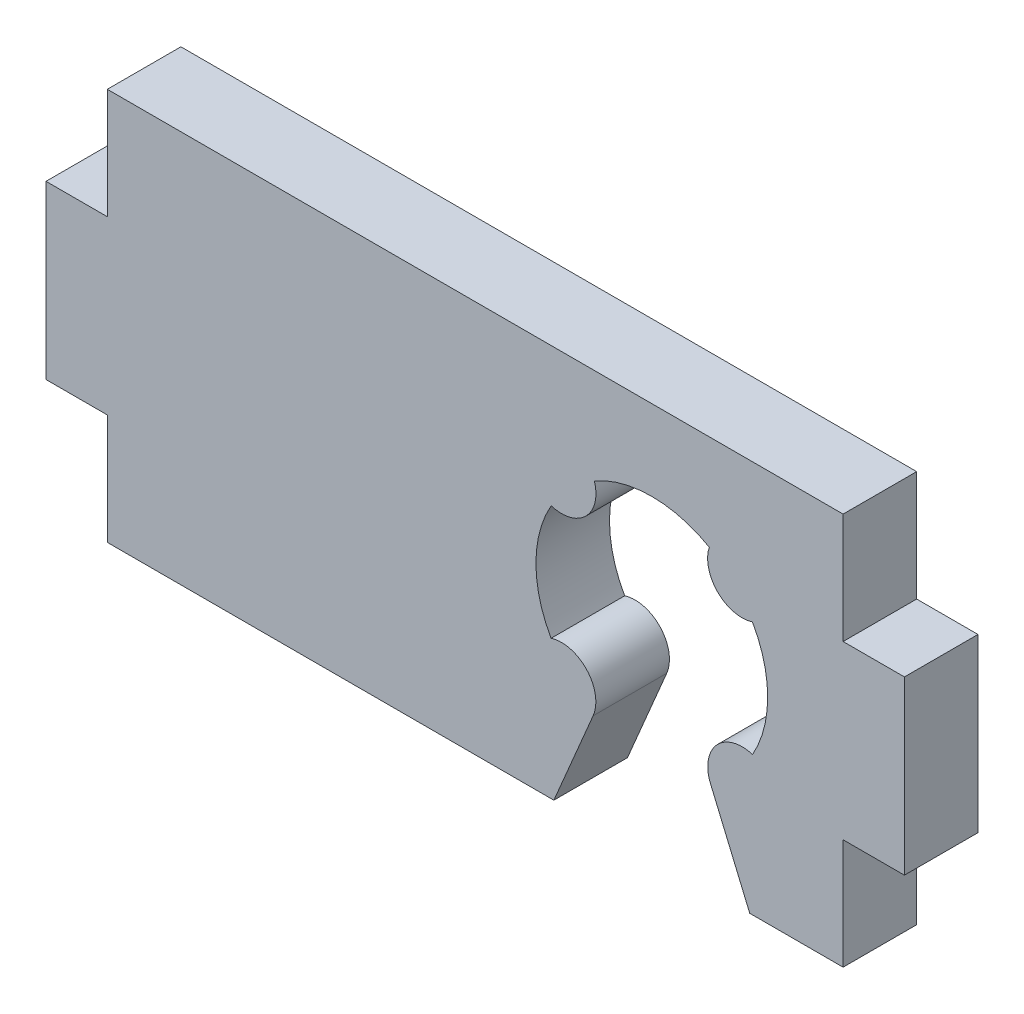
ISO-10303-21;
HEADER;
FILE_DESCRIPTION(('STEP AP214'),'2;1');
FILE_NAME('part.step','',(''),(''),'','','');
FILE_SCHEMA(('AUTOMOTIVE_DESIGN { 1 0 10303 214 1 1 1 1 }'));
ENDSEC;
DATA;
#1=APPLICATION_CONTEXT('core data for automotive mechanical design processes');
#2=APPLICATION_PROTOCOL_DEFINITION('international standard','automotive_design',2000,#1);
#3=PRODUCT_CONTEXT('',#1,'mechanical');
#4=PRODUCT('Part','Part','',(#3));
#5=PRODUCT_RELATED_PRODUCT_CATEGORY('part','',(#4));
#6=PRODUCT_DEFINITION_FORMATION('','',#4);
#7=PRODUCT_DEFINITION_CONTEXT('part definition',#1,'design');
#8=PRODUCT_DEFINITION('design','',#6,#7);
#9=PRODUCT_DEFINITION_SHAPE('','',#8);
#10=(LENGTH_UNIT() NAMED_UNIT(*) SI_UNIT(.MILLI.,.METRE.));
#11=(NAMED_UNIT(*) PLANE_ANGLE_UNIT() SI_UNIT($,.RADIAN.));
#12=(NAMED_UNIT(*) SI_UNIT($,.STERADIAN.) SOLID_ANGLE_UNIT());
#13=UNCERTAINTY_MEASURE_WITH_UNIT(LENGTH_MEASURE(1.E-05),#10,'distance_accuracy_value','');
#14=(GEOMETRIC_REPRESENTATION_CONTEXT(3) GLOBAL_UNCERTAINTY_ASSIGNED_CONTEXT((#13)) GLOBAL_UNIT_ASSIGNED_CONTEXT((#10,
#11,#12)) REPRESENTATION_CONTEXT('',''));
#15=CARTESIAN_POINT('',(0.,0.,0.));
#16=DIRECTION('',(0.,0.,1.));
#17=DIRECTION('',(1.,0.,0.));
#18=AXIS2_PLACEMENT_3D('',#15,#16,#17);
#19=CARTESIAN_POINT('',(-3.67695526217091,3.67695526216971,3.));
#20=DIRECTION('',(0.,0.,-1.));
#21=DIRECTION('',(-1.,0.,0.));
#22=AXIS2_PLACEMENT_3D('',#19,#20,#21);
#23=CYLINDRICAL_SURFACE('',#22,1.40000000000013);
#24=CARTESIAN_POINT('',(-3.67695526217091,3.67695526216971,0.));
#25=DIRECTION('',(0.,0.,1.));
#26=DIRECTION('',(1.,0.,0.));
#27=AXIS2_PLACEMENT_3D('',#24,#25,#26);
#28=CIRCLE('',#27,1.40000000000013);
#29=CARTESIAN_POINT('',(-4.10296874274699,2.34334643107724,0.));
#30=VERTEX_POINT('',#29);
#31=CARTESIAN_POINT('',(-2.34334643107859,4.10296874274622,0.));
#32=VERTEX_POINT('',#31);
#33=EDGE_CURVE('E213',#30,#32,#28,.T.);
#34=ORIENTED_EDGE('',*,*,#33,.T.);
#35=DIRECTION('',(0.,0.,-1.));
#36=VECTOR('',#35,1.);
#37=CARTESIAN_POINT('',(-2.34334643107859,4.10296874274622,3.));
#38=LINE('',#37,#36);
#39=CARTESIAN_POINT('',(-2.34334643107859,4.10296874274622,3.));
#40=VERTEX_POINT('',#39);
#41=EDGE_CURVE('E11',#40,#32,#38,.T.);
#42=ORIENTED_EDGE('',*,*,#41,.F.);
#43=CARTESIAN_POINT('',(-3.67695526217091,3.67695526216971,3.));
#44=DIRECTION('',(0.,0.,1.));
#45=DIRECTION('',(1.,0.,0.));
#46=AXIS2_PLACEMENT_3D('',#43,#44,#45);
#47=CIRCLE('',#46,1.40000000000013);
#48=CARTESIAN_POINT('',(-4.10296874274699,2.34334643107724,3.));
#49=VERTEX_POINT('',#48);
#50=EDGE_CURVE('E255',#49,#40,#47,.T.);
#51=ORIENTED_EDGE('',*,*,#50,.F.);
#52=DIRECTION('',(0.,0.,-1.));
#53=VECTOR('',#52,1.);
#54=CARTESIAN_POINT('',(-4.10296874274699,2.34334643107724,3.));
#55=LINE('',#54,#53);
#56=EDGE_CURVE('E209',#49,#30,#55,.T.);
#57=ORIENTED_EDGE('',*,*,#56,.T.);
#58=EDGE_LOOP('',(#34,#42,#51,#57));
#59=FACE_BOUND('',#58,.T.);
#60=ADVANCED_FACE('F33',(#59),#23,.T.);
#61=CARTESIAN_POINT('',(0.,0.,3.));
#62=DIRECTION('',(0.,0.,-1.));
#63=DIRECTION('',(-1.,0.,0.));
#64=AXIS2_PLACEMENT_3D('',#61,#62,#63);
#65=CYLINDRICAL_SURFACE('',#64,4.72500000000013);
#66=CARTESIAN_POINT('',(0.,0.,0.));
#67=DIRECTION('',(0.,0.,-1.));
#68=DIRECTION('',(1.,0.,0.));
#69=AXIS2_PLACEMENT_3D('',#66,#67,#68);
#70=CIRCLE('',#69,4.72500000000013);
#71=CARTESIAN_POINT('',(2.34334643107843,4.10296874274631,0.));
#72=VERTEX_POINT('',#71);
#73=EDGE_CURVE('E216',#32,#72,#70,.T.);
#74=ORIENTED_EDGE('',*,*,#73,.T.);
#75=DIRECTION('',(0.,0.,-1.));
#76=VECTOR('',#75,1.);
#77=CARTESIAN_POINT('',(2.34334643107843,4.10296874274631,3.));
#78=LINE('',#77,#76);
#79=CARTESIAN_POINT('',(2.34334643107843,4.10296874274631,3.));
#80=VERTEX_POINT('',#79);
#81=EDGE_CURVE('E41',#80,#72,#78,.T.);
#82=ORIENTED_EDGE('',*,*,#81,.F.);
#83=CARTESIAN_POINT('',(0.,0.,3.));
#84=DIRECTION('',(0.,0.,-1.));
#85=DIRECTION('',(1.,0.,0.));
#86=AXIS2_PLACEMENT_3D('',#83,#84,#85);
#87=CIRCLE('',#86,4.72500000000013);
#88=EDGE_CURVE('E134',#40,#80,#87,.T.);
#89=ORIENTED_EDGE('',*,*,#88,.F.);
#90=ORIENTED_EDGE('',*,*,#41,.T.);
#91=EDGE_LOOP('',(#74,#82,#89,#90));
#92=FACE_BOUND('',#91,.T.);
#93=ADVANCED_FACE('F383',(#92),#65,.F.);
#94=CARTESIAN_POINT('',(3.67695526217077,3.67695526216985,3.));
#95=DIRECTION('',(0.,0.,-1.));
#96=DIRECTION('',(-1.,0.,0.));
#97=AXIS2_PLACEMENT_3D('',#94,#95,#96);
#98=CYLINDRICAL_SURFACE('',#97,1.40000000000013);
#99=CARTESIAN_POINT('',(3.67695526217077,3.67695526216985,0.));
#100=DIRECTION('',(0.,0.,1.));
#101=DIRECTION('',(1.,0.,0.));
#102=AXIS2_PLACEMENT_3D('',#99,#100,#101);
#103=CIRCLE('',#102,1.40000000000013);
#104=CARTESIAN_POINT('',(4.1029687427469,2.3433464310774,0.));
#105=VERTEX_POINT('',#104);
#106=EDGE_CURVE('E218',#72,#105,#103,.T.);
#107=ORIENTED_EDGE('',*,*,#106,.T.);
#108=DIRECTION('',(0.,0.,-1.));
#109=VECTOR('',#108,1.);
#110=CARTESIAN_POINT('',(4.1029687427469,2.3433464310774,3.));
#111=LINE('',#110,#109);
#112=CARTESIAN_POINT('',(4.1029687427469,2.3433464310774,3.));
#113=VERTEX_POINT('',#112);
#114=EDGE_CURVE('E304',#113,#105,#111,.T.);
#115=ORIENTED_EDGE('',*,*,#114,.F.);
#116=CARTESIAN_POINT('',(3.67695526217077,3.67695526216985,3.));
#117=DIRECTION('',(0.,0.,1.));
#118=DIRECTION('',(1.,0.,0.));
#119=AXIS2_PLACEMENT_3D('',#116,#117,#118);
#120=CIRCLE('',#119,1.40000000000013);
#121=EDGE_CURVE('E312',#80,#113,#120,.T.);
#122=ORIENTED_EDGE('',*,*,#121,.F.);
#123=ORIENTED_EDGE('',*,*,#81,.T.);
#124=EDGE_LOOP('',(#107,#115,#122,#123));
#125=FACE_BOUND('',#124,.T.);
#126=ADVANCED_FACE('F310',(#125),#98,.T.);
#127=CARTESIAN_POINT('',(0.,0.,3.));
#128=DIRECTION('',(0.,0.,-1.));
#129=DIRECTION('',(-1.,0.,0.));
#130=AXIS2_PLACEMENT_3D('',#127,#128,#129);
#131=CYLINDRICAL_SURFACE('',#130,4.72500000000013);
#132=CARTESIAN_POINT('',(0.,0.,0.));
#133=DIRECTION('',(0.,0.,-1.));
#134=DIRECTION('',(1.,0.,0.));
#135=AXIS2_PLACEMENT_3D('',#132,#133,#134);
#136=CIRCLE('',#135,4.72500000000013);
#137=CARTESIAN_POINT('',(4.10580344966254,-2.33837615296181,0.));
#138=VERTEX_POINT('',#137);
#139=EDGE_CURVE('E220',#105,#138,#136,.T.);
#140=ORIENTED_EDGE('',*,*,#139,.T.);
#141=DIRECTION('',(0.,0.,-1.));
#142=VECTOR('',#141,1.);
#143=CARTESIAN_POINT('',(4.10580344966254,-2.33837615296181,3.));
#144=LINE('',#143,#142);
#145=CARTESIAN_POINT('',(4.10580344966254,-2.33837615296181,3.));
#146=VERTEX_POINT('',#145);
#147=EDGE_CURVE('E301',#146,#138,#144,.T.);
#148=ORIENTED_EDGE('',*,*,#147,.F.);
#149=CARTESIAN_POINT('',(0.,0.,3.));
#150=DIRECTION('',(0.,0.,-1.));
#151=DIRECTION('',(1.,0.,0.));
#152=AXIS2_PLACEMENT_3D('',#149,#150,#151);
#153=CIRCLE('',#152,4.72500000000013);
#154=EDGE_CURVE('E330',#113,#146,#153,.T.);
#155=ORIENTED_EDGE('',*,*,#154,.F.);
#156=ORIENTED_EDGE('',*,*,#114,.T.);
#157=EDGE_LOOP('',(#140,#148,#155,#156));
#158=FACE_BOUND('',#157,.T.);
#159=ADVANCED_FACE('F321',(#158),#131,.F.);
#160=CARTESIAN_POINT('',(3.68140523779082,-3.67249989450921,3.));
#161=DIRECTION('',(0.,0.,-1.));
#162=DIRECTION('',(-1.,0.,0.));
#163=AXIS2_PLACEMENT_3D('',#160,#161,#162);
#164=CYLINDRICAL_SURFACE('',#163,1.40000000000013);
#165=CARTESIAN_POINT('',(3.68140523779082,-3.67249989450921,0.));
#166=DIRECTION('',(0.,0.,1.));
#167=DIRECTION('',(1.,0.,0.));
#168=AXIS2_PLACEMENT_3D('',#165,#166,#167);
#169=CIRCLE('',#168,1.40000000000013);
#170=CARTESIAN_POINT('',(2.39220905243628,-4.21836910564651,0.));
#171=VERTEX_POINT('',#170);
#172=EDGE_CURVE('E222',#138,#171,#169,.T.);
#173=ORIENTED_EDGE('',*,*,#172,.T.);
#174=DIRECTION('',(0.,0.,-1.));
#175=VECTOR('',#174,1.);
#176=CARTESIAN_POINT('',(2.39220905243628,-4.21836910564651,3.));
#177=LINE('',#176,#175);
#178=CARTESIAN_POINT('',(2.39220905243628,-4.21836910564651,3.));
#179=VERTEX_POINT('',#178);
#180=EDGE_CURVE('E298',#179,#171,#177,.T.);
#181=ORIENTED_EDGE('',*,*,#180,.F.);
#182=CARTESIAN_POINT('',(3.68140523779082,-3.67249989450921,3.));
#183=DIRECTION('',(0.,0.,1.));
#184=DIRECTION('',(1.,0.,0.));
#185=AXIS2_PLACEMENT_3D('',#182,#183,#184);
#186=CIRCLE('',#185,1.40000000000013);
#187=EDGE_CURVE('E327',#146,#179,#186,.T.);
#188=ORIENTED_EDGE('',*,*,#187,.F.);
#189=ORIENTED_EDGE('',*,*,#147,.T.);
#190=EDGE_LOOP('',(#173,#181,#188,#189));
#191=FACE_BOUND('',#190,.T.);
#192=ADVANCED_FACE('F325',(#191),#164,.T.);
#193=CARTESIAN_POINT('',(2.39220905243628,-4.21836910564651,3.));
#194=DIRECTION('',(0.920854418110301,0.389906579383752,0.));
#195=DIRECTION('',(-0.389906579383752,0.920854418110301,0.));
#196=AXIS2_PLACEMENT_3D('',#193,#194,#195);
#197=PLANE('',#196);
#198=DIRECTION('',(0.389906579383752,-0.920854418110301,0.));
#199=VECTOR('',#198,1.);
#200=CARTESIAN_POINT('',(2.39220905243628,-4.21836910564651,0.));
#201=LINE('',#200,#199);
#202=CARTESIAN_POINT('',(3.9934206419237,-7.99999999999902,0.));
#203=VERTEX_POINT('',#202);
#204=EDGE_CURVE('E224',#171,#203,#201,.T.);
#205=ORIENTED_EDGE('',*,*,#204,.T.);
#206=DIRECTION('',(0.,0.,-1.));
#207=VECTOR('',#206,1.);
#208=CARTESIAN_POINT('',(3.9934206419237,-7.99999999999902,3.));
#209=LINE('',#208,#207);
#210=CARTESIAN_POINT('',(3.9934206419237,-7.99999999999902,3.));
#211=VERTEX_POINT('',#210);
#212=EDGE_CURVE('E295',#211,#203,#209,.T.);
#213=ORIENTED_EDGE('',*,*,#212,.F.);
#214=DIRECTION('',(0.389906579383752,-0.920854418110301,0.));
#215=VECTOR('',#214,1.);
#216=CARTESIAN_POINT('',(2.39220905243628,-4.21836910564651,3.));
#217=LINE('',#216,#215);
#218=EDGE_CURVE('E329',#179,#211,#217,.T.);
#219=ORIENTED_EDGE('',*,*,#218,.F.);
#220=ORIENTED_EDGE('',*,*,#180,.T.);
#221=EDGE_LOOP('',(#205,#213,#219,#220));
#222=FACE_BOUND('',#221,.T.);
#223=ADVANCED_FACE('F396',(#222),#197,.F.);
#224=CARTESIAN_POINT('',(3.9934206419237,-7.99999999999902,3.));
#225=DIRECTION('',(0.,1.,0.));
#226=DIRECTION('',(-1.,0.,0.));
#227=AXIS2_PLACEMENT_3D('',#224,#225,#226);
#228=PLANE('',#227);
#229=DIRECTION('',(1.,0.,0.));
#230=VECTOR('',#229,1.);
#231=CARTESIAN_POINT('',(3.9934206419237,-7.99999999999902,0.));
#232=LINE('',#231,#230);
#233=CARTESIAN_POINT('',(7.79999999999933,-7.99999999999902,0.));
#234=VERTEX_POINT('',#233);
#235=EDGE_CURVE('E226',#203,#234,#232,.T.);
#236=ORIENTED_EDGE('',*,*,#235,.T.);
#237=DIRECTION('',(0.,0.,-1.));
#238=VECTOR('',#237,1.);
#239=CARTESIAN_POINT('',(7.79999999999933,-7.99999999999902,3.));
#240=LINE('',#239,#238);
#241=CARTESIAN_POINT('',(7.79999999999933,-7.99999999999902,3.));
#242=VERTEX_POINT('',#241);
#243=EDGE_CURVE('E292',#242,#234,#240,.T.);
#244=ORIENTED_EDGE('',*,*,#243,.F.);
#245=DIRECTION('',(1.,0.,0.));
#246=VECTOR('',#245,1.);
#247=CARTESIAN_POINT('',(3.9934206419237,-7.99999999999902,3.));
#248=LINE('',#247,#246);
#249=EDGE_CURVE('E332',#211,#242,#248,.T.);
#250=ORIENTED_EDGE('',*,*,#249,.F.);
#251=ORIENTED_EDGE('',*,*,#212,.T.);
#252=EDGE_LOOP('',(#236,#244,#250,#251));
#253=FACE_BOUND('',#252,.T.);
#254=ADVANCED_FACE('F399',(#253),#228,.F.);
#255=CARTESIAN_POINT('',(7.79999999999933,-7.99999999999902,3.));
#256=DIRECTION('',(-1.,0.,0.));
#257=DIRECTION('',(0.,0.,1.));
#258=AXIS2_PLACEMENT_3D('',#255,#256,#257);
#259=PLANE('',#258);
#260=DIRECTION('',(0.,1.,0.));
#261=VECTOR('',#260,1.);
#262=CARTESIAN_POINT('',(7.79999999999933,-7.99999999999902,0.));
#263=LINE('',#262,#261);
#264=CARTESIAN_POINT('',(7.79999999999933,-3.50000000000031,0.));
#265=VERTEX_POINT('',#264);
#266=EDGE_CURVE('E228',#234,#265,#263,.T.);
#267=ORIENTED_EDGE('',*,*,#266,.T.);
#268=DIRECTION('',(0.,0.,-1.));
#269=VECTOR('',#268,1.);
#270=CARTESIAN_POINT('',(7.79999999999933,-3.50000000000031,3.));
#271=LINE('',#270,#269);
#272=CARTESIAN_POINT('',(7.79999999999933,-3.50000000000031,3.));
#273=VERTEX_POINT('',#272);
#274=EDGE_CURVE('E289',#273,#265,#271,.T.);
#275=ORIENTED_EDGE('',*,*,#274,.F.);
#276=DIRECTION('',(0.,1.,0.));
#277=VECTOR('',#276,1.);
#278=CARTESIAN_POINT('',(7.79999999999933,-7.99999999999902,3.));
#279=LINE('',#278,#277);
#280=EDGE_CURVE('E338',#242,#273,#279,.T.);
#281=ORIENTED_EDGE('',*,*,#280,.F.);
#282=ORIENTED_EDGE('',*,*,#243,.T.);
#283=EDGE_LOOP('',(#267,#275,#281,#282));
#284=FACE_BOUND('',#283,.T.);
#285=ADVANCED_FACE('F403',(#284),#259,.F.);
#286=CARTESIAN_POINT('',(10.3000000000002,-3.50000000000031,3.));
#287=DIRECTION('',(0.,1.,0.));
#288=DIRECTION('',(-1.,0.,0.));
#289=AXIS2_PLACEMENT_3D('',#286,#287,#288);
#290=PLANE('',#289);
#291=DIRECTION('',(1.,0.,0.));
#292=VECTOR('',#291,1.);
#293=CARTESIAN_POINT('',(10.3000000000002,-3.50000000000031,0.));
#294=LINE('',#293,#292);
#295=CARTESIAN_POINT('',(10.3000000000002,-3.50000000000031,0.));
#296=VERTEX_POINT('',#295);
#297=EDGE_CURVE('E230',#265,#296,#294,.T.);
#298=ORIENTED_EDGE('',*,*,#297,.T.);
#299=DIRECTION('',(0.,0.,-1.));
#300=VECTOR('',#299,1.);
#301=CARTESIAN_POINT('',(10.3000000000002,-3.50000000000031,3.));
#302=LINE('',#301,#300);
#303=CARTESIAN_POINT('',(10.3000000000002,-3.50000000000031,3.));
#304=VERTEX_POINT('',#303);
#305=EDGE_CURVE('E286',#304,#296,#302,.T.);
#306=ORIENTED_EDGE('',*,*,#305,.F.);
#307=DIRECTION('',(1.,0.,0.));
#308=VECTOR('',#307,1.);
#309=CARTESIAN_POINT('',(10.3000000000002,-3.50000000000031,3.));
#310=LINE('',#309,#308);
#311=EDGE_CURVE('E340',#273,#304,#310,.T.);
#312=ORIENTED_EDGE('',*,*,#311,.F.);
#313=ORIENTED_EDGE('',*,*,#274,.T.);
#314=EDGE_LOOP('',(#298,#306,#312,#313));
#315=FACE_BOUND('',#314,.T.);
#316=ADVANCED_FACE('F407',(#315),#290,.F.);
#317=CARTESIAN_POINT('',(10.3000000000002,3.49999999999981,3.));
#318=DIRECTION('',(-1.,0.,0.));
#319=DIRECTION('',(0.,0.,1.));
#320=AXIS2_PLACEMENT_3D('',#317,#318,#319);
#321=PLANE('',#320);
#322=DIRECTION('',(0.,1.,0.));
#323=VECTOR('',#322,1.);
#324=CARTESIAN_POINT('',(10.3000000000002,3.49999999999981,0.));
#325=LINE('',#324,#323);
#326=CARTESIAN_POINT('',(10.3000000000002,3.49999999999981,0.));
#327=VERTEX_POINT('',#326);
#328=EDGE_CURVE('E232',#296,#327,#325,.T.);
#329=ORIENTED_EDGE('',*,*,#328,.T.);
#330=DIRECTION('',(0.,0.,-1.));
#331=VECTOR('',#330,1.);
#332=CARTESIAN_POINT('',(10.3000000000002,3.49999999999981,3.));
#333=LINE('',#332,#331);
#334=CARTESIAN_POINT('',(10.3000000000002,3.49999999999981,3.));
#335=VERTEX_POINT('',#334);
#336=EDGE_CURVE('E283',#335,#327,#333,.T.);
#337=ORIENTED_EDGE('',*,*,#336,.F.);
#338=DIRECTION('',(0.,1.,0.));
#339=VECTOR('',#338,1.);
#340=CARTESIAN_POINT('',(10.3000000000002,3.49999999999981,3.));
#341=LINE('',#340,#339);
#342=EDGE_CURVE('E342',#304,#335,#341,.T.);
#343=ORIENTED_EDGE('',*,*,#342,.F.);
#344=ORIENTED_EDGE('',*,*,#305,.T.);
#345=EDGE_LOOP('',(#329,#337,#343,#344));
#346=FACE_BOUND('',#345,.T.);
#347=ADVANCED_FACE('F411',(#346),#321,.F.);
#348=CARTESIAN_POINT('',(10.3000000000002,3.49999999999981,3.));
#349=DIRECTION('',(0.,-1.,0.));
#350=DIRECTION('',(1.,0.,0.));
#351=AXIS2_PLACEMENT_3D('',#348,#349,#350);
#352=PLANE('',#351);
#353=DIRECTION('',(-1.,0.,0.));
#354=VECTOR('',#353,1.);
#355=CARTESIAN_POINT('',(10.3000000000002,3.49999999999981,0.));
#356=LINE('',#355,#354);
#357=CARTESIAN_POINT('',(7.79999999999933,3.49999999999981,0.));
#358=VERTEX_POINT('',#357);
#359=EDGE_CURVE('E234',#327,#358,#356,.T.);
#360=ORIENTED_EDGE('',*,*,#359,.T.);
#361=DIRECTION('',(0.,0.,-1.));
#362=VECTOR('',#361,1.);
#363=CARTESIAN_POINT('',(7.79999999999933,3.49999999999981,3.));
#364=LINE('',#363,#362);
#365=CARTESIAN_POINT('',(7.79999999999933,3.49999999999981,3.));
#366=VERTEX_POINT('',#365);
#367=EDGE_CURVE('E280',#366,#358,#364,.T.);
#368=ORIENTED_EDGE('',*,*,#367,.F.);
#369=DIRECTION('',(-1.,0.,0.));
#370=VECTOR('',#369,1.);
#371=CARTESIAN_POINT('',(10.3000000000002,3.49999999999981,3.));
#372=LINE('',#371,#370);
#373=EDGE_CURVE('E344',#335,#366,#372,.T.);
#374=ORIENTED_EDGE('',*,*,#373,.F.);
#375=ORIENTED_EDGE('',*,*,#336,.T.);
#376=EDGE_LOOP('',(#360,#368,#374,#375));
#377=FACE_BOUND('',#376,.T.);
#378=ADVANCED_FACE('F415',(#377),#352,.F.);
#379=CARTESIAN_POINT('',(7.79999999999933,3.49999999999981,3.));
#380=DIRECTION('',(-1.,0.,0.));
#381=DIRECTION('',(0.,0.,1.));
#382=AXIS2_PLACEMENT_3D('',#379,#380,#381);
#383=PLANE('',#382);
#384=DIRECTION('',(0.,1.,0.));
#385=VECTOR('',#384,1.);
#386=CARTESIAN_POINT('',(7.79999999999933,3.49999999999981,0.));
#387=LINE('',#386,#385);
#388=CARTESIAN_POINT('',(7.79999999999933,7.99999999999977,0.));
#389=VERTEX_POINT('',#388);
#390=EDGE_CURVE('E236',#358,#389,#387,.T.);
#391=ORIENTED_EDGE('',*,*,#390,.T.);
#392=DIRECTION('',(0.,0.,-1.));
#393=VECTOR('',#392,1.);
#394=CARTESIAN_POINT('',(7.79999999999933,7.99999999999977,3.));
#395=LINE('',#394,#393);
#396=CARTESIAN_POINT('',(7.79999999999933,7.99999999999977,3.));
#397=VERTEX_POINT('',#396);
#398=EDGE_CURVE('E277',#397,#389,#395,.T.);
#399=ORIENTED_EDGE('',*,*,#398,.F.);
#400=DIRECTION('',(0.,1.,0.));
#401=VECTOR('',#400,1.);
#402=CARTESIAN_POINT('',(7.79999999999933,3.49999999999981,3.));
#403=LINE('',#402,#401);
#404=EDGE_CURVE('E346',#366,#397,#403,.T.);
#405=ORIENTED_EDGE('',*,*,#404,.F.);
#406=ORIENTED_EDGE('',*,*,#367,.T.);
#407=EDGE_LOOP('',(#391,#399,#405,#406));
#408=FACE_BOUND('',#407,.T.);
#409=ADVANCED_FACE('F419',(#408),#383,.F.);
#410=CARTESIAN_POINT('',(7.79999999999933,7.99999999999977,3.));
#411=DIRECTION('',(0.,-1.,0.));
#412=DIRECTION('',(1.,0.,0.));
#413=AXIS2_PLACEMENT_3D('',#410,#411,#412);
#414=PLANE('',#413);
#415=DIRECTION('',(-1.,0.,0.));
#416=VECTOR('',#415,1.);
#417=CARTESIAN_POINT('',(7.79999999999933,7.99999999999977,0.));
#418=LINE('',#417,#416);
#419=CARTESIAN_POINT('',(-22.2000000000007,7.99999999999977,0.));
#420=VERTEX_POINT('',#419);
#421=EDGE_CURVE('E238',#389,#420,#418,.T.);
#422=ORIENTED_EDGE('',*,*,#421,.T.);
#423=DIRECTION('',(0.,0.,-1.));
#424=VECTOR('',#423,1.);
#425=CARTESIAN_POINT('',(-22.2000000000007,7.99999999999977,3.));
#426=LINE('',#425,#424);
#427=CARTESIAN_POINT('',(-22.2000000000007,7.99999999999977,3.));
#428=VERTEX_POINT('',#427);
#429=EDGE_CURVE('E274',#428,#420,#426,.T.);
#430=ORIENTED_EDGE('',*,*,#429,.F.);
#431=DIRECTION('',(-1.,0.,0.));
#432=VECTOR('',#431,1.);
#433=CARTESIAN_POINT('',(7.79999999999933,7.99999999999977,3.));
#434=LINE('',#433,#432);
#435=EDGE_CURVE('E348',#397,#428,#434,.T.);
#436=ORIENTED_EDGE('',*,*,#435,.F.);
#437=ORIENTED_EDGE('',*,*,#398,.T.);
#438=EDGE_LOOP('',(#422,#430,#436,#437));
#439=FACE_BOUND('',#438,.T.);
#440=ADVANCED_FACE('F423',(#439),#414,.F.);
#441=CARTESIAN_POINT('',(-22.2000000000007,7.99999999999977,3.));
#442=DIRECTION('',(1.,0.,0.));
#443=DIRECTION('',(0.,0.,-1.));
#444=AXIS2_PLACEMENT_3D('',#441,#442,#443);
#445=PLANE('',#444);
#446=DIRECTION('',(0.,-1.,0.));
#447=VECTOR('',#446,1.);
#448=CARTESIAN_POINT('',(-22.2000000000007,7.99999999999977,0.));
#449=LINE('',#448,#447);
#450=CARTESIAN_POINT('',(-22.2000000000007,3.49999999999981,0.));
#451=VERTEX_POINT('',#450);
#452=EDGE_CURVE('E240',#420,#451,#449,.T.);
#453=ORIENTED_EDGE('',*,*,#452,.T.);
#454=DIRECTION('',(0.,0.,-1.));
#455=VECTOR('',#454,1.);
#456=CARTESIAN_POINT('',(-22.2000000000007,3.49999999999981,3.));
#457=LINE('',#456,#455);
#458=CARTESIAN_POINT('',(-22.2000000000007,3.49999999999981,3.));
#459=VERTEX_POINT('',#458);
#460=EDGE_CURVE('E271',#459,#451,#457,.T.);
#461=ORIENTED_EDGE('',*,*,#460,.F.);
#462=DIRECTION('',(0.,-1.,0.));
#463=VECTOR('',#462,1.);
#464=CARTESIAN_POINT('',(-22.2000000000007,7.99999999999977,3.));
#465=LINE('',#464,#463);
#466=EDGE_CURVE('E350',#428,#459,#465,.T.);
#467=ORIENTED_EDGE('',*,*,#466,.F.);
#468=ORIENTED_EDGE('',*,*,#429,.T.);
#469=EDGE_LOOP('',(#453,#461,#467,#468));
#470=FACE_BOUND('',#469,.T.);
#471=ADVANCED_FACE('F427',(#470),#445,.F.);
#472=CARTESIAN_POINT('',(-24.6999999999998,3.49999999999981,3.));
#473=DIRECTION('',(0.,-1.,0.));
#474=DIRECTION('',(0.,0.,-1.));
#475=AXIS2_PLACEMENT_3D('',#472,#473,#474);
#476=PLANE('',#475);
#477=DIRECTION('',(-1.,0.,0.));
#478=VECTOR('',#477,1.);
#479=CARTESIAN_POINT('',(-24.6999999999998,3.49999999999981,0.));
#480=LINE('',#479,#478);
#481=CARTESIAN_POINT('',(-24.6999999999998,3.49999999999981,0.));
#482=VERTEX_POINT('',#481);
#483=EDGE_CURVE('E242',#451,#482,#480,.T.);
#484=ORIENTED_EDGE('',*,*,#483,.T.);
#485=DIRECTION('',(0.,0.,-1.));
#486=VECTOR('',#485,1.);
#487=CARTESIAN_POINT('',(-24.6999999999998,3.49999999999981,3.));
#488=LINE('',#487,#486);
#489=CARTESIAN_POINT('',(-24.6999999999998,3.49999999999981,3.));
#490=VERTEX_POINT('',#489);
#491=EDGE_CURVE('E268',#490,#482,#488,.T.);
#492=ORIENTED_EDGE('',*,*,#491,.F.);
#493=DIRECTION('',(-1.,0.,0.));
#494=VECTOR('',#493,1.);
#495=CARTESIAN_POINT('',(-24.6999999999998,3.49999999999981,3.));
#496=LINE('',#495,#494);
#497=EDGE_CURVE('E352',#459,#490,#496,.T.);
#498=ORIENTED_EDGE('',*,*,#497,.F.);
#499=ORIENTED_EDGE('',*,*,#460,.T.);
#500=EDGE_LOOP('',(#484,#492,#498,#499));
#501=FACE_BOUND('',#500,.T.);
#502=ADVANCED_FACE('F431',(#501),#476,.F.);
#503=CARTESIAN_POINT('',(-24.6999999999998,-3.50000000000031,3.));
#504=DIRECTION('',(1.,0.,0.));
#505=DIRECTION('',(0.,0.,-1.));
#506=AXIS2_PLACEMENT_3D('',#503,#504,#505);
#507=PLANE('',#506);
#508=DIRECTION('',(0.,-1.,0.));
#509=VECTOR('',#508,1.);
#510=CARTESIAN_POINT('',(-24.6999999999998,-3.50000000000031,0.));
#511=LINE('',#510,#509);
#512=CARTESIAN_POINT('',(-24.6999999999998,-3.50000000000031,0.));
#513=VERTEX_POINT('',#512);
#514=EDGE_CURVE('E244',#482,#513,#511,.T.);
#515=ORIENTED_EDGE('',*,*,#514,.T.);
#516=DIRECTION('',(0.,0.,-1.));
#517=VECTOR('',#516,1.);
#518=CARTESIAN_POINT('',(-24.6999999999998,-3.50000000000031,3.));
#519=LINE('',#518,#517);
#520=CARTESIAN_POINT('',(-24.6999999999998,-3.50000000000031,3.));
#521=VERTEX_POINT('',#520);
#522=EDGE_CURVE('E265',#521,#513,#519,.T.);
#523=ORIENTED_EDGE('',*,*,#522,.F.);
#524=DIRECTION('',(0.,-1.,0.));
#525=VECTOR('',#524,1.);
#526=CARTESIAN_POINT('',(-24.6999999999998,-3.50000000000031,3.));
#527=LINE('',#526,#525);
#528=EDGE_CURVE('E354',#490,#521,#527,.T.);
#529=ORIENTED_EDGE('',*,*,#528,.F.);
#530=ORIENTED_EDGE('',*,*,#491,.T.);
#531=EDGE_LOOP('',(#515,#523,#529,#530));
#532=FACE_BOUND('',#531,.T.);
#533=ADVANCED_FACE('F435',(#532),#507,.F.);
#534=CARTESIAN_POINT('',(-24.6999999999998,-3.50000000000031,3.));
#535=DIRECTION('',(0.,1.,0.));
#536=DIRECTION('',(-1.,0.,0.));
#537=AXIS2_PLACEMENT_3D('',#534,#535,#536);
#538=PLANE('',#537);
#539=DIRECTION('',(1.,0.,0.));
#540=VECTOR('',#539,1.);
#541=CARTESIAN_POINT('',(-24.6999999999998,-3.50000000000031,0.));
#542=LINE('',#541,#540);
#543=CARTESIAN_POINT('',(-22.2000000000007,-3.50000000000031,0.));
#544=VERTEX_POINT('',#543);
#545=EDGE_CURVE('E246',#513,#544,#542,.T.);
#546=ORIENTED_EDGE('',*,*,#545,.T.);
#547=DIRECTION('',(0.,0.,-1.));
#548=VECTOR('',#547,1.);
#549=CARTESIAN_POINT('',(-22.2000000000007,-3.50000000000031,3.));
#550=LINE('',#549,#548);
#551=CARTESIAN_POINT('',(-22.2000000000007,-3.50000000000031,3.));
#552=VERTEX_POINT('',#551);
#553=EDGE_CURVE('E262',#552,#544,#550,.T.);
#554=ORIENTED_EDGE('',*,*,#553,.F.);
#555=DIRECTION('',(1.,0.,0.));
#556=VECTOR('',#555,1.);
#557=CARTESIAN_POINT('',(-24.6999999999998,-3.50000000000031,3.));
#558=LINE('',#557,#556);
#559=EDGE_CURVE('E356',#521,#552,#558,.T.);
#560=ORIENTED_EDGE('',*,*,#559,.F.);
#561=ORIENTED_EDGE('',*,*,#522,.T.);
#562=EDGE_LOOP('',(#546,#554,#560,#561));
#563=FACE_BOUND('',#562,.T.);
#564=ADVANCED_FACE('F439',(#563),#538,.F.);
#565=CARTESIAN_POINT('',(-22.2000000000007,-3.50000000000031,3.));
#566=DIRECTION('',(1.,0.,0.));
#567=DIRECTION('',(0.,0.,-1.));
#568=AXIS2_PLACEMENT_3D('',#565,#566,#567);
#569=PLANE('',#568);
#570=DIRECTION('',(0.,-1.,0.));
#571=VECTOR('',#570,1.);
#572=CARTESIAN_POINT('',(-22.2000000000007,-3.50000000000031,0.));
#573=LINE('',#572,#571);
#574=CARTESIAN_POINT('',(-22.2000000000007,-7.99999999999903,0.));
#575=VERTEX_POINT('',#574);
#576=EDGE_CURVE('E248',#544,#575,#573,.T.);
#577=ORIENTED_EDGE('',*,*,#576,.T.);
#578=DIRECTION('',(0.,0.,-1.));
#579=VECTOR('',#578,1.);
#580=CARTESIAN_POINT('',(-22.2000000000007,-7.99999999999903,3.));
#581=LINE('',#580,#579);
#582=CARTESIAN_POINT('',(-22.2000000000007,-7.99999999999903,3.));
#583=VERTEX_POINT('',#582);
#584=EDGE_CURVE('E259',#583,#575,#581,.T.);
#585=ORIENTED_EDGE('',*,*,#584,.F.);
#586=DIRECTION('',(0.,-1.,0.));
#587=VECTOR('',#586,1.);
#588=CARTESIAN_POINT('',(-22.2000000000007,-3.50000000000031,3.));
#589=LINE('',#588,#587);
#590=EDGE_CURVE('E358',#552,#583,#589,.T.);
#591=ORIENTED_EDGE('',*,*,#590,.F.);
#592=ORIENTED_EDGE('',*,*,#553,.T.);
#593=EDGE_LOOP('',(#577,#585,#591,#592));
#594=FACE_BOUND('',#593,.T.);
#595=ADVANCED_FACE('F364',(#594),#569,.F.);
#596=CARTESIAN_POINT('',(-22.2000000000007,-7.99999999999903,3.));
#597=DIRECTION('',(0.,1.,0.));
#598=DIRECTION('',(-1.,0.,0.));
#599=AXIS2_PLACEMENT_3D('',#596,#597,#598);
#600=PLANE('',#599);
#601=DIRECTION('',(1.,0.,0.));
#602=VECTOR('',#601,1.);
#603=CARTESIAN_POINT('',(-22.2000000000007,-7.99999999999903,0.));
#604=LINE('',#603,#602);
#605=CARTESIAN_POINT('',(-3.99342064192515,-7.99999999999903,0.));
#606=VERTEX_POINT('',#605);
#607=EDGE_CURVE('E250',#575,#606,#604,.T.);
#608=ORIENTED_EDGE('',*,*,#607,.T.);
#609=DIRECTION('',(0.,0.,-1.));
#610=VECTOR('',#609,1.);
#611=CARTESIAN_POINT('',(-3.99342064192515,-7.99999999999903,3.));
#612=LINE('',#611,#610);
#613=CARTESIAN_POINT('',(-3.99342064192515,-7.99999999999903,3.));
#614=VERTEX_POINT('',#613);
#615=EDGE_CURVE('E204',#614,#606,#612,.T.);
#616=ORIENTED_EDGE('',*,*,#615,.F.);
#617=DIRECTION('',(1.,0.,0.));
#618=VECTOR('',#617,1.);
#619=CARTESIAN_POINT('',(-22.2000000000007,-7.99999999999903,3.));
#620=LINE('',#619,#618);
#621=EDGE_CURVE('E195',#583,#614,#620,.T.);
#622=ORIENTED_EDGE('',*,*,#621,.F.);
#623=ORIENTED_EDGE('',*,*,#584,.T.);
#624=EDGE_LOOP('',(#608,#616,#622,#623));
#625=FACE_BOUND('',#624,.T.);
#626=ADVANCED_FACE('F368',(#625),#600,.F.);
#627=CARTESIAN_POINT('',(-3.99342064192515,-7.99999999999903,3.));
#628=DIRECTION('',(-0.920854418110133,0.389906579384151,0.));
#629=DIRECTION('',(-0.389906579384151,-0.920854418110133,0.));
#630=AXIS2_PLACEMENT_3D('',#627,#628,#629);
#631=PLANE('',#630);
#632=DIRECTION('',(0.389906579384151,0.920854418110133,0.));
#633=VECTOR('',#632,1.);
#634=CARTESIAN_POINT('',(-3.99342064192515,-7.99999999999903,0.));
#635=LINE('',#634,#633);
#636=CARTESIAN_POINT('',(-2.39220905243618,-4.21836910564741,0.));
#637=VERTEX_POINT('',#636);
#638=EDGE_CURVE('E203',#606,#637,#635,.T.);
#639=ORIENTED_EDGE('',*,*,#638,.T.);
#640=DIRECTION('',(0.,0.,-1.));
#641=VECTOR('',#640,1.);
#642=CARTESIAN_POINT('',(-2.39220905243618,-4.21836910564741,3.));
#643=LINE('',#642,#641);
#644=CARTESIAN_POINT('',(-2.39220905243618,-4.21836910564741,3.));
#645=VERTEX_POINT('',#644);
#646=EDGE_CURVE('E200',#645,#637,#643,.T.);
#647=ORIENTED_EDGE('',*,*,#646,.F.);
#648=DIRECTION('',(0.389906579384151,0.920854418110133,0.));
#649=VECTOR('',#648,1.);
#650=CARTESIAN_POINT('',(-3.99342064192515,-7.99999999999903,3.));
#651=LINE('',#650,#649);
#652=EDGE_CURVE('E189',#614,#645,#651,.T.);
#653=ORIENTED_EDGE('',*,*,#652,.F.);
#654=ORIENTED_EDGE('',*,*,#615,.T.);
#655=EDGE_LOOP('',(#639,#647,#653,#654));
#656=FACE_BOUND('',#655,.T.);
#657=ADVANCED_FACE('F201',(#656),#631,.F.);
#658=CARTESIAN_POINT('',(-3.68140523779048,-3.67249989450955,3.));
#659=DIRECTION('',(0.,0.,-1.));
#660=DIRECTION('',(-1.,0.,0.));
#661=AXIS2_PLACEMENT_3D('',#658,#659,#660);
#662=CYLINDRICAL_SURFACE('',#661,1.40000000000013);
#663=CARTESIAN_POINT('',(-3.68140523779048,-3.67249989450955,0.));
#664=DIRECTION('',(0.,0.,1.));
#665=DIRECTION('',(1.,0.,0.));
#666=AXIS2_PLACEMENT_3D('',#663,#664,#665);
#667=CIRCLE('',#666,1.40000000000013);
#668=CARTESIAN_POINT('',(-4.10580344966232,-2.33837615296218,0.));
#669=VERTEX_POINT('',#668);
#670=EDGE_CURVE('E120',#637,#669,#667,.T.);
#671=ORIENTED_EDGE('',*,*,#670,.T.);
#672=DIRECTION('',(0.,0.,-1.));
#673=VECTOR('',#672,1.);
#674=CARTESIAN_POINT('',(-4.10580344966232,-2.33837615296218,3.));
#675=LINE('',#674,#673);
#676=CARTESIAN_POINT('',(-4.10580344966232,-2.33837615296218,3.));
#677=VERTEX_POINT('',#676);
#678=EDGE_CURVE('E205',#677,#669,#675,.T.);
#679=ORIENTED_EDGE('',*,*,#678,.F.);
#680=CARTESIAN_POINT('',(-3.68140523779048,-3.67249989450955,3.));
#681=DIRECTION('',(0.,0.,1.));
#682=DIRECTION('',(1.,0.,0.));
#683=AXIS2_PLACEMENT_3D('',#680,#681,#682);
#684=CIRCLE('',#683,1.40000000000013);
#685=EDGE_CURVE('E193',#645,#677,#684,.T.);
#686=ORIENTED_EDGE('',*,*,#685,.F.);
#687=ORIENTED_EDGE('',*,*,#646,.T.);
#688=EDGE_LOOP('',(#671,#679,#686,#687));
#689=FACE_BOUND('',#688,.T.);
#690=ADVANCED_FACE('F207',(#689),#662,.T.);
#691=CARTESIAN_POINT('',(0.,0.,3.));
#692=DIRECTION('',(0.,0.,-1.));
#693=DIRECTION('',(-1.,0.,0.));
#694=AXIS2_PLACEMENT_3D('',#691,#692,#693);
#695=CYLINDRICAL_SURFACE('',#694,4.72500000000013);
#696=CARTESIAN_POINT('',(0.,0.,0.));
#697=DIRECTION('',(0.,0.,-1.));
#698=DIRECTION('',(1.,0.,0.));
#699=AXIS2_PLACEMENT_3D('',#696,#697,#698);
#700=CIRCLE('',#699,4.72500000000013);
#701=EDGE_CURVE('E126',#669,#30,#700,.T.);
#702=ORIENTED_EDGE('',*,*,#701,.T.);
#703=ORIENTED_EDGE('',*,*,#56,.F.);
#704=CARTESIAN_POINT('',(0.,0.,3.));
#705=DIRECTION('',(0.,0.,-1.));
#706=DIRECTION('',(1.,0.,0.));
#707=AXIS2_PLACEMENT_3D('',#704,#705,#706);
#708=CIRCLE('',#707,4.72500000000013);
#709=EDGE_CURVE('E49',#677,#49,#708,.T.);
#710=ORIENTED_EDGE('',*,*,#709,.F.);
#711=ORIENTED_EDGE('',*,*,#678,.T.);
#712=EDGE_LOOP('',(#702,#703,#710,#711));
#713=FACE_BOUND('',#712,.T.);
#714=ADVANCED_FACE('F372',(#713),#695,.F.);
#715=CARTESIAN_POINT('',(-3.67695526217091,3.67695526216971,3.));
#716=DIRECTION('',(0.,0.,1.));
#717=DIRECTION('',(1.,0.,0.));
#718=AXIS2_PLACEMENT_3D('',#715,#716,#717);
#719=PLANE('',#718);
#720=ORIENTED_EDGE('',*,*,#50,.T.);
#721=ORIENTED_EDGE('',*,*,#88,.T.);
#722=ORIENTED_EDGE('',*,*,#121,.T.);
#723=ORIENTED_EDGE('',*,*,#154,.T.);
#724=ORIENTED_EDGE('',*,*,#187,.T.);
#725=ORIENTED_EDGE('',*,*,#218,.T.);
#726=ORIENTED_EDGE('',*,*,#249,.T.);
#727=ORIENTED_EDGE('',*,*,#280,.T.);
#728=ORIENTED_EDGE('',*,*,#311,.T.);
#729=ORIENTED_EDGE('',*,*,#342,.T.);
#730=ORIENTED_EDGE('',*,*,#373,.T.);
#731=ORIENTED_EDGE('',*,*,#404,.T.);
#732=ORIENTED_EDGE('',*,*,#435,.T.);
#733=ORIENTED_EDGE('',*,*,#466,.T.);
#734=ORIENTED_EDGE('',*,*,#497,.T.);
#735=ORIENTED_EDGE('',*,*,#528,.T.);
#736=ORIENTED_EDGE('',*,*,#559,.T.);
#737=ORIENTED_EDGE('',*,*,#590,.T.);
#738=ORIENTED_EDGE('',*,*,#621,.T.);
#739=ORIENTED_EDGE('',*,*,#652,.T.);
#740=ORIENTED_EDGE('',*,*,#685,.T.);
#741=ORIENTED_EDGE('',*,*,#709,.T.);
#742=EDGE_LOOP('',(#720,#721,#722,#723,#724,#725,#726,#727,#728,#729,#730,#731,#732,#733,#734,
#735,#736,#737,#738,#739,#740,#741));
#743=FACE_BOUND('',#742,.T.);
#744=ADVANCED_FACE('F191',(#743),#719,.T.);
#745=CARTESIAN_POINT('',(-3.67695526217091,3.67695526216971,0.));
#746=DIRECTION('',(0.,0.,1.));
#747=DIRECTION('',(1.,0.,0.));
#748=AXIS2_PLACEMENT_3D('',#745,#746,#747);
#749=PLANE('',#748);
#750=ORIENTED_EDGE('',*,*,#33,.F.);
#751=ORIENTED_EDGE('',*,*,#701,.F.);
#752=ORIENTED_EDGE('',*,*,#670,.F.);
#753=ORIENTED_EDGE('',*,*,#638,.F.);
#754=ORIENTED_EDGE('',*,*,#607,.F.);
#755=ORIENTED_EDGE('',*,*,#576,.F.);
#756=ORIENTED_EDGE('',*,*,#545,.F.);
#757=ORIENTED_EDGE('',*,*,#514,.F.);
#758=ORIENTED_EDGE('',*,*,#483,.F.);
#759=ORIENTED_EDGE('',*,*,#452,.F.);
#760=ORIENTED_EDGE('',*,*,#421,.F.);
#761=ORIENTED_EDGE('',*,*,#390,.F.);
#762=ORIENTED_EDGE('',*,*,#359,.F.);
#763=ORIENTED_EDGE('',*,*,#328,.F.);
#764=ORIENTED_EDGE('',*,*,#297,.F.);
#765=ORIENTED_EDGE('',*,*,#266,.F.);
#766=ORIENTED_EDGE('',*,*,#235,.F.);
#767=ORIENTED_EDGE('',*,*,#204,.F.);
#768=ORIENTED_EDGE('',*,*,#172,.F.);
#769=ORIENTED_EDGE('',*,*,#139,.F.);
#770=ORIENTED_EDGE('',*,*,#106,.F.);
#771=ORIENTED_EDGE('',*,*,#73,.F.);
#772=EDGE_LOOP('',(#750,#751,#752,#753,#754,#755,#756,#757,#758,#759,#760,#761,#762,#763,#764,
#765,#766,#767,#768,#769,#770,#771));
#773=FACE_BOUND('',#772,.T.);
#774=ADVANCED_FACE('F316',(#773),#749,.F.);
#775=CLOSED_SHELL('',(#60,#93,#126,#159,#192,#223,#254,#285,#316,#347,#378,#409,#440,#471,#502,
#533,#564,#595,#626,#657,#690,#714,#744,#774));
#776=MANIFOLD_SOLID_BREP('B2',#775);
#777=ADVANCED_BREP_SHAPE_REPRESENTATION('',(#18,#776),#14);
#778=SHAPE_DEFINITION_REPRESENTATION(#9,#777);
ENDSEC;
END-ISO-10303-21;
